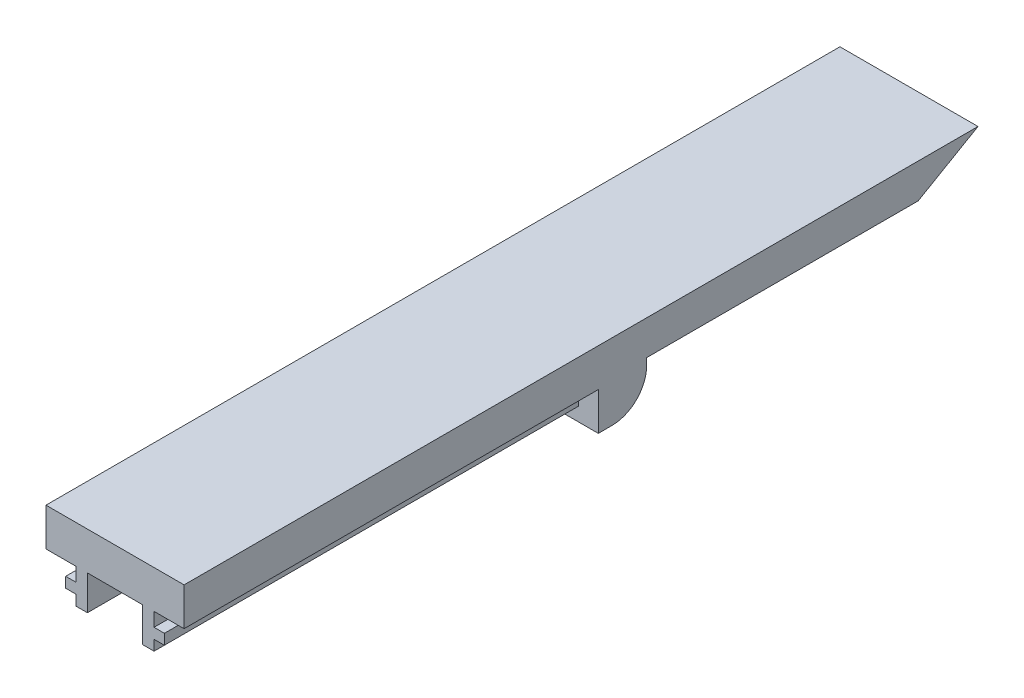
ISO-10303-21;
HEADER;
FILE_DESCRIPTION(('STEP AP214'),'2;1');
FILE_NAME('part.step','',(''),(''),'','','');
FILE_SCHEMA(('AUTOMOTIVE_DESIGN { 1 0 10303 214 1 1 1 1 }'));
ENDSEC;
DATA;
#1=APPLICATION_CONTEXT('core data for automotive mechanical design processes');
#2=APPLICATION_PROTOCOL_DEFINITION('international standard','automotive_design',2000,#1);
#3=PRODUCT_CONTEXT('',#1,'mechanical');
#4=PRODUCT('Part','Part','',(#3));
#5=PRODUCT_RELATED_PRODUCT_CATEGORY('part','',(#4));
#6=PRODUCT_DEFINITION_FORMATION('','',#4);
#7=PRODUCT_DEFINITION_CONTEXT('part definition',#1,'design');
#8=PRODUCT_DEFINITION('design','',#6,#7);
#9=PRODUCT_DEFINITION_SHAPE('','',#8);
#10=(LENGTH_UNIT() NAMED_UNIT(*) SI_UNIT(.MILLI.,.METRE.));
#11=(NAMED_UNIT(*) PLANE_ANGLE_UNIT() SI_UNIT($,.RADIAN.));
#12=(NAMED_UNIT(*) SI_UNIT($,.STERADIAN.) SOLID_ANGLE_UNIT());
#13=UNCERTAINTY_MEASURE_WITH_UNIT(LENGTH_MEASURE(1.E-05),#10,'distance_accuracy_value','');
#14=(GEOMETRIC_REPRESENTATION_CONTEXT(3) GLOBAL_UNCERTAINTY_ASSIGNED_CONTEXT((#13)) GLOBAL_UNIT_ASSIGNED_CONTEXT((#10,
#11,#12)) REPRESENTATION_CONTEXT('',''));
#15=CARTESIAN_POINT('',(0.,0.,0.));
#16=DIRECTION('',(0.,0.,1.));
#17=DIRECTION('',(1.,0.,0.));
#18=AXIS2_PLACEMENT_3D('',#15,#16,#17);
#19=CARTESIAN_POINT('',(0.,-39.8788629522422,-23.0240722604533));
#20=DIRECTION('',(0.,-0.866025403784438,-0.500000000000001));
#21=DIRECTION('',(0.,0.500000000000001,-0.866025403784438));
#22=AXIS2_PLACEMENT_3D('',#19,#20,#21);
#23=PLANE('',#22);
#24=DIRECTION('',(0.,0.500000000000001,-0.866025403784438));
#25=VECTOR('',#24,1.);
#26=CARTESIAN_POINT('',(-6.53631284916201,12.4734636871508,-113.700961894323));
#27=LINE('',#26,#25);
#28=CARTESIAN_POINT('',(-6.53631284916201,8.22346368715084,-106.339745962156));
#29=VERTEX_POINT('',#28);
#30=CARTESIAN_POINT('',(-6.53631284916201,13.2234636871508,-115.));
#31=VERTEX_POINT('',#30);
#32=EDGE_CURVE('E225',#29,#31,#27,.T.);
#33=ORIENTED_EDGE('',*,*,#32,.F.);
#34=DIRECTION('',(-1.,0.,0.));
#35=VECTOR('',#34,1.);
#36=CARTESIAN_POINT('',(0.,8.22346368715084,-106.339745962156));
#37=LINE('',#36,#35);
#38=CARTESIAN_POINT('',(-26.536312849162,8.22346368715083,-106.339745962156));
#39=VERTEX_POINT('',#38);
#40=EDGE_CURVE('E208',#29,#39,#37,.T.);
#41=ORIENTED_EDGE('',*,*,#40,.T.);
#42=DIRECTION('',(0.,-0.500000000000001,0.866025403784438));
#43=VECTOR('',#42,1.);
#44=CARTESIAN_POINT('',(-26.536312849162,12.4734636871508,-113.700961894323));
#45=LINE('',#44,#43);
#46=CARTESIAN_POINT('',(-26.536312849162,13.2234636871508,-115.));
#47=VERTEX_POINT('',#46);
#48=EDGE_CURVE('E229',#47,#39,#45,.T.);
#49=ORIENTED_EDGE('',*,*,#48,.F.);
#50=DIRECTION('',(-1.,0.,0.));
#51=VECTOR('',#50,1.);
#52=CARTESIAN_POINT('',(-6.53631284916201,13.2234636871508,-115.));
#53=LINE('',#52,#51);
#54=EDGE_CURVE('E241',#31,#47,#53,.T.);
#55=ORIENTED_EDGE('',*,*,#54,.F.);
#56=EDGE_LOOP('',(#33,#41,#49,#55));
#57=FACE_BOUND('',#56,.T.);
#58=ADVANCED_FACE('F37',(#57),#23,.T.);
#59=CARTESIAN_POINT('',(-26.536312849162,2.22346368715084,-115.));
#60=DIRECTION('',(0.,-1.,0.));
#61=DIRECTION('',(0.,0.,-1.));
#62=AXIS2_PLACEMENT_3D('',#59,#60,#61);
#63=PLANE('',#62);
#64=DIRECTION('',(0.,0.,1.));
#65=VECTOR('',#64,1.);
#66=CARTESIAN_POINT('',(-26.536312849162,2.22346368715084,-115.));
#67=LINE('',#66,#65);
#68=CARTESIAN_POINT('',(-26.536312849162,2.22346368715084,-62.));
#69=VERTEX_POINT('',#68);
#70=CARTESIAN_POINT('',(-26.536312849162,2.22346368715084,-60.));
#71=VERTEX_POINT('',#70);
#72=EDGE_CURVE('E396',#69,#71,#67,.T.);
#73=ORIENTED_EDGE('',*,*,#72,.F.);
#74=DIRECTION('',(-1.,0.,0.));
#75=VECTOR('',#74,1.);
#76=CARTESIAN_POINT('',(-6.53631284916201,2.22346368715084,-62.));
#77=LINE('',#76,#75);
#78=CARTESIAN_POINT('',(-6.53631284916201,2.22346368715084,-62.));
#79=VERTEX_POINT('',#78);
#80=EDGE_CURVE('E45',#69,#79,#77,.F.);
#81=ORIENTED_EDGE('',*,*,#80,.T.);
#82=DIRECTION('',(0.,0.,1.));
#83=VECTOR('',#82,1.);
#84=CARTESIAN_POINT('',(-6.53631284916201,2.22346368715084,-115.));
#85=LINE('',#84,#83);
#86=CARTESIAN_POINT('',(-6.53631284916201,2.22346368715084,-60.));
#87=VERTEX_POINT('',#86);
#88=EDGE_CURVE('E397',#79,#87,#85,.T.);
#89=ORIENTED_EDGE('',*,*,#88,.T.);
#90=DIRECTION('',(1.,0.,0.));
#91=VECTOR('',#90,1.);
#92=CARTESIAN_POINT('',(-26.536312849162,2.22346368715084,-60.));
#93=LINE('',#92,#91);
#94=EDGE_CURVE('E248',#71,#87,#93,.T.);
#95=ORIENTED_EDGE('',*,*,#94,.F.);
#96=EDGE_LOOP('',(#73,#81,#89,#95));
#97=FACE_BOUND('',#96,.T.);
#98=ADVANCED_FACE('F429',(#97),#63,.T.);
#99=CARTESIAN_POINT('',(-26.536312849162,10.2234636871508,-115.));
#100=DIRECTION('',(-1.,0.,0.));
#101=DIRECTION('',(0.,0.,1.));
#102=AXIS2_PLACEMENT_3D('',#99,#100,#101);
#103=PLANE('',#102);
#104=DIRECTION('',(0.,-1.,0.));
#105=VECTOR('',#104,1.);
#106=CARTESIAN_POINT('',(-26.536312849162,8.22346368715084,-67.));
#107=LINE('',#106,#105);
#108=CARTESIAN_POINT('',(-26.536312849162,8.22346368715084,-67.));
#109=VERTEX_POINT('',#108);
#110=CARTESIAN_POINT('',(-26.536312849162,7.22346368715084,-67.));
#111=VERTEX_POINT('',#110);
#112=EDGE_CURVE('E220',#109,#111,#107,.T.);
#113=ORIENTED_EDGE('',*,*,#112,.T.);
#114=CARTESIAN_POINT('',(-26.536312849162,7.22346368715084,-62.));
#115=DIRECTION('',(-1.,0.,0.));
#116=DIRECTION('',(0.,0.,1.));
#117=AXIS2_PLACEMENT_3D('',#114,#115,#116);
#118=CIRCLE('',#117,5.);
#119=EDGE_CURVE('E59',#111,#69,#118,.T.);
#120=ORIENTED_EDGE('',*,*,#119,.T.);
#121=ORIENTED_EDGE('',*,*,#72,.T.);
#122=DIRECTION('',(0.,-1.,0.));
#123=VECTOR('',#122,1.);
#124=CARTESIAN_POINT('',(-26.536312849162,7.72346368715084,-60.));
#125=LINE('',#124,#123);
#126=CARTESIAN_POINT('',(-26.536312849162,7.72346368715084,-60.));
#127=VERTEX_POINT('',#126);
#128=EDGE_CURVE('E245',#127,#71,#125,.T.);
#129=ORIENTED_EDGE('',*,*,#128,.F.);
#130=DIRECTION('',(0.,0.,1.));
#131=VECTOR('',#130,1.);
#132=CARTESIAN_POINT('',(-26.536312849162,7.72346368715084,-60.));
#133=LINE('',#132,#131);
#134=CARTESIAN_POINT('',(-26.536312849162,7.72346368715084,0.));
#135=VERTEX_POINT('',#134);
#136=EDGE_CURVE('E355',#127,#135,#133,.T.);
#137=ORIENTED_EDGE('',*,*,#136,.T.);
#138=DIRECTION('',(0.,-1.,0.));
#139=VECTOR('',#138,1.);
#140=CARTESIAN_POINT('',(-26.536312849162,10.2234636871508,0.));
#141=LINE('',#140,#139);
#142=CARTESIAN_POINT('',(-26.536312849162,13.2234636871508,0.));
#143=VERTEX_POINT('',#142);
#144=EDGE_CURVE('E358',#143,#135,#141,.T.);
#145=ORIENTED_EDGE('',*,*,#144,.F.);
#146=DIRECTION('',(0.,0.,1.));
#147=VECTOR('',#146,1.);
#148=CARTESIAN_POINT('',(-26.536312849162,13.2234636871508,-115.));
#149=LINE('',#148,#147);
#150=EDGE_CURVE('E232',#47,#143,#149,.T.);
#151=ORIENTED_EDGE('',*,*,#150,.F.);
#152=ORIENTED_EDGE('',*,*,#48,.T.);
#153=DIRECTION('',(0.,0.,-1.));
#154=VECTOR('',#153,1.);
#155=CARTESIAN_POINT('',(-26.536312849162,8.22346368715084,-67.));
#156=LINE('',#155,#154);
#157=EDGE_CURVE('E212',#109,#39,#156,.T.);
#158=ORIENTED_EDGE('',*,*,#157,.F.);
#159=EDGE_LOOP('',(#113,#120,#121,#129,#137,#145,#151,#152,#158));
#160=FACE_BOUND('',#159,.T.);
#161=ADVANCED_FACE('F404',(#160),#103,.T.);
#162=CARTESIAN_POINT('',(-6.53631284916201,10.2234636871508,-115.));
#163=DIRECTION('',(1.,0.,0.));
#164=DIRECTION('',(0.,1.,0.));
#165=AXIS2_PLACEMENT_3D('',#162,#163,#164);
#166=PLANE('',#165);
#167=ORIENTED_EDGE('',*,*,#88,.F.);
#168=CARTESIAN_POINT('',(-6.53631284916201,7.22346368715084,-62.));
#169=DIRECTION('',(1.,0.,0.));
#170=DIRECTION('',(0.,1.,0.));
#171=AXIS2_PLACEMENT_3D('',#168,#169,#170);
#172=CIRCLE('',#171,5.);
#173=CARTESIAN_POINT('',(-6.53631284916201,7.22346368715084,-67.));
#174=VERTEX_POINT('',#173);
#175=EDGE_CURVE('E11',#79,#174,#172,.T.);
#176=ORIENTED_EDGE('',*,*,#175,.T.);
#177=DIRECTION('',(0.,-1.,0.));
#178=VECTOR('',#177,1.);
#179=CARTESIAN_POINT('',(-6.53631284916201,8.22346368715084,-67.));
#180=LINE('',#179,#178);
#181=CARTESIAN_POINT('',(-6.53631284916201,8.22346368715084,-67.));
#182=VERTEX_POINT('',#181);
#183=EDGE_CURVE('E218',#182,#174,#180,.T.);
#184=ORIENTED_EDGE('',*,*,#183,.F.);
#185=DIRECTION('',(0.,0.,1.));
#186=VECTOR('',#185,1.);
#187=CARTESIAN_POINT('',(-6.53631284916201,8.22346368715084,-67.));
#188=LINE('',#187,#186);
#189=EDGE_CURVE('E202',#29,#182,#188,.T.);
#190=ORIENTED_EDGE('',*,*,#189,.F.);
#191=ORIENTED_EDGE('',*,*,#32,.T.);
#192=DIRECTION('',(0.,0.,-1.));
#193=VECTOR('',#192,1.);
#194=CARTESIAN_POINT('',(-6.53631284916201,13.2234636871508,0.));
#195=LINE('',#194,#193);
#196=CARTESIAN_POINT('',(-6.53631284916201,13.2234636871508,0.));
#197=VERTEX_POINT('',#196);
#198=EDGE_CURVE('E238',#197,#31,#195,.T.);
#199=ORIENTED_EDGE('',*,*,#198,.F.);
#200=DIRECTION('',(0.,1.,0.));
#201=VECTOR('',#200,1.);
#202=CARTESIAN_POINT('',(-6.53631284916201,10.2234636871508,0.));
#203=LINE('',#202,#201);
#204=CARTESIAN_POINT('',(-6.53631284916201,7.72346368715084,0.));
#205=VERTEX_POINT('',#204);
#206=EDGE_CURVE('E394',#205,#197,#203,.T.);
#207=ORIENTED_EDGE('',*,*,#206,.F.);
#208=DIRECTION('',(0.,0.,1.));
#209=VECTOR('',#208,1.);
#210=CARTESIAN_POINT('',(-6.53631284916202,7.72346368715084,-60.));
#211=LINE('',#210,#209);
#212=CARTESIAN_POINT('',(-6.53631284916202,7.72346368715084,-60.));
#213=VERTEX_POINT('',#212);
#214=EDGE_CURVE('E306',#213,#205,#211,.T.);
#215=ORIENTED_EDGE('',*,*,#214,.F.);
#216=DIRECTION('',(0.,1.,0.));
#217=VECTOR('',#216,1.);
#218=CARTESIAN_POINT('',(-6.53631284916202,7.72346368715084,-60.));
#219=LINE('',#218,#217);
#220=EDGE_CURVE('E252',#87,#213,#219,.T.);
#221=ORIENTED_EDGE('',*,*,#220,.F.);
#222=EDGE_LOOP('',(#167,#176,#184,#190,#191,#199,#207,#215,#221));
#223=FACE_BOUND('',#222,.T.);
#224=ADVANCED_FACE('F222',(#223),#166,.T.);
#225=CARTESIAN_POINT('',(0.,0.,0.));
#226=DIRECTION('',(0.,0.,1.));
#227=DIRECTION('',(1.,0.,0.));
#228=AXIS2_PLACEMENT_3D('',#225,#226,#227);
#229=PLANE('',#228);
#230=DIRECTION('',(-1.,0.,0.));
#231=VECTOR('',#230,1.);
#232=CARTESIAN_POINT('',(-26.536312849162,7.72346368715084,0.));
#233=LINE('',#232,#231);
#234=CARTESIAN_POINT('',(-22.186312849162,7.72346368715084,0.));
#235=VERTEX_POINT('',#234);
#236=EDGE_CURVE('E249',#235,#135,#233,.T.);
#237=ORIENTED_EDGE('',*,*,#236,.F.);
#238=DIRECTION('',(0.,1.,0.));
#239=VECTOR('',#238,1.);
#240=CARTESIAN_POINT('',(-22.186312849162,7.72346368715084,0.));
#241=LINE('',#240,#239);
#242=CARTESIAN_POINT('',(-22.186312849162,5.72346368715084,0.));
#243=VERTEX_POINT('',#242);
#244=EDGE_CURVE('E351',#243,#235,#241,.T.);
#245=ORIENTED_EDGE('',*,*,#244,.F.);
#246=DIRECTION('',(1.,0.,0.));
#247=VECTOR('',#246,1.);
#248=CARTESIAN_POINT('',(-22.186312849162,5.72346368715084,0.));
#249=LINE('',#248,#247);
#250=CARTESIAN_POINT('',(-23.686312849162,5.72346368715084,0.));
#251=VERTEX_POINT('',#250);
#252=EDGE_CURVE('E348',#251,#243,#249,.T.);
#253=ORIENTED_EDGE('',*,*,#252,.F.);
#254=DIRECTION('',(0.,1.,0.));
#255=VECTOR('',#254,1.);
#256=CARTESIAN_POINT('',(-23.686312849162,5.72346368715084,0.));
#257=LINE('',#256,#255);
#258=CARTESIAN_POINT('',(-23.686312849162,4.22346368715084,0.));
#259=VERTEX_POINT('',#258);
#260=EDGE_CURVE('E345',#259,#251,#257,.T.);
#261=ORIENTED_EDGE('',*,*,#260,.F.);
#262=DIRECTION('',(-1.,0.,0.));
#263=VECTOR('',#262,1.);
#264=CARTESIAN_POINT('',(-23.686312849162,4.22346368715084,0.));
#265=LINE('',#264,#263);
#266=CARTESIAN_POINT('',(-22.186312849162,4.22346368715084,0.));
#267=VERTEX_POINT('',#266);
#268=EDGE_CURVE('E342',#267,#259,#265,.T.);
#269=ORIENTED_EDGE('',*,*,#268,.F.);
#270=DIRECTION('',(0.,1.,0.));
#271=VECTOR('',#270,1.);
#272=CARTESIAN_POINT('',(-22.186312849162,4.22346368715084,0.));
#273=LINE('',#272,#271);
#274=CARTESIAN_POINT('',(-22.186312849162,2.72346368715084,0.));
#275=VERTEX_POINT('',#274);
#276=EDGE_CURVE('E339',#275,#267,#273,.T.);
#277=ORIENTED_EDGE('',*,*,#276,.F.);
#278=DIRECTION('',(-1.,0.,0.));
#279=VECTOR('',#278,1.);
#280=CARTESIAN_POINT('',(-22.186312849162,2.72346368715084,0.));
#281=LINE('',#280,#279);
#282=CARTESIAN_POINT('',(-20.536312849162,2.72346368715084,0.));
#283=VERTEX_POINT('',#282);
#284=EDGE_CURVE('E336',#283,#275,#281,.T.);
#285=ORIENTED_EDGE('',*,*,#284,.F.);
#286=DIRECTION('',(0.,-1.,0.));
#287=VECTOR('',#286,1.);
#288=CARTESIAN_POINT('',(-20.536312849162,2.72346368715084,0.));
#289=LINE('',#288,#287);
#290=CARTESIAN_POINT('',(-20.536312849162,7.72346368715084,0.));
#291=VERTEX_POINT('',#290);
#292=EDGE_CURVE('E333',#291,#283,#289,.T.);
#293=ORIENTED_EDGE('',*,*,#292,.F.);
#294=DIRECTION('',(-1.,0.,0.));
#295=VECTOR('',#294,1.);
#296=CARTESIAN_POINT('',(-20.536312849162,7.72346368715084,0.));
#297=LINE('',#296,#295);
#298=CARTESIAN_POINT('',(-12.536312849162,7.72346368715084,0.));
#299=VERTEX_POINT('',#298);
#300=EDGE_CURVE('E330',#299,#291,#297,.T.);
#301=ORIENTED_EDGE('',*,*,#300,.F.);
#302=DIRECTION('',(0.,1.,0.));
#303=VECTOR('',#302,1.);
#304=CARTESIAN_POINT('',(-12.536312849162,2.72346368715084,0.));
#305=LINE('',#304,#303);
#306=CARTESIAN_POINT('',(-12.536312849162,2.72346368715084,0.));
#307=VERTEX_POINT('',#306);
#308=EDGE_CURVE('E327',#307,#299,#305,.T.);
#309=ORIENTED_EDGE('',*,*,#308,.F.);
#310=DIRECTION('',(-1.,0.,0.));
#311=VECTOR('',#310,1.);
#312=CARTESIAN_POINT('',(-10.886312849162,2.72346368715084,0.));
#313=LINE('',#312,#311);
#314=CARTESIAN_POINT('',(-10.886312849162,2.72346368715084,0.));
#315=VERTEX_POINT('',#314);
#316=EDGE_CURVE('E324',#315,#307,#313,.T.);
#317=ORIENTED_EDGE('',*,*,#316,.F.);
#318=DIRECTION('',(0.,-1.,0.));
#319=VECTOR('',#318,1.);
#320=CARTESIAN_POINT('',(-10.886312849162,4.22346368715084,0.));
#321=LINE('',#320,#319);
#322=CARTESIAN_POINT('',(-10.886312849162,4.22346368715084,0.));
#323=VERTEX_POINT('',#322);
#324=EDGE_CURVE('E321',#323,#315,#321,.T.);
#325=ORIENTED_EDGE('',*,*,#324,.F.);
#326=DIRECTION('',(-1.,0.,0.));
#327=VECTOR('',#326,1.);
#328=CARTESIAN_POINT('',(-9.38631284916202,4.22346368715084,0.));
#329=LINE('',#328,#327);
#330=CARTESIAN_POINT('',(-9.38631284916202,4.22346368715084,0.));
#331=VERTEX_POINT('',#330);
#332=EDGE_CURVE('E318',#331,#323,#329,.T.);
#333=ORIENTED_EDGE('',*,*,#332,.F.);
#334=DIRECTION('',(0.,-1.,0.));
#335=VECTOR('',#334,1.);
#336=CARTESIAN_POINT('',(-9.38631284916202,5.72346368715084,0.));
#337=LINE('',#336,#335);
#338=CARTESIAN_POINT('',(-9.38631284916202,5.72346368715084,0.));
#339=VERTEX_POINT('',#338);
#340=EDGE_CURVE('E315',#339,#331,#337,.T.);
#341=ORIENTED_EDGE('',*,*,#340,.F.);
#342=DIRECTION('',(1.,0.,0.));
#343=VECTOR('',#342,1.);
#344=CARTESIAN_POINT('',(-10.886312849162,5.72346368715084,0.));
#345=LINE('',#344,#343);
#346=CARTESIAN_POINT('',(-10.886312849162,5.72346368715084,0.));
#347=VERTEX_POINT('',#346);
#348=EDGE_CURVE('E312',#347,#339,#345,.T.);
#349=ORIENTED_EDGE('',*,*,#348,.F.);
#350=DIRECTION('',(0.,-1.,0.));
#351=VECTOR('',#350,1.);
#352=CARTESIAN_POINT('',(-10.886312849162,7.72346368715084,0.));
#353=LINE('',#352,#351);
#354=CARTESIAN_POINT('',(-10.886312849162,7.72346368715084,0.));
#355=VERTEX_POINT('',#354);
#356=EDGE_CURVE('E309',#355,#347,#353,.T.);
#357=ORIENTED_EDGE('',*,*,#356,.F.);
#358=DIRECTION('',(-1.,0.,0.));
#359=VECTOR('',#358,1.);
#360=CARTESIAN_POINT('',(-6.53631284916202,7.72346368715084,0.));
#361=LINE('',#360,#359);
#362=EDGE_CURVE('E244',#205,#355,#361,.T.);
#363=ORIENTED_EDGE('',*,*,#362,.F.);
#364=ORIENTED_EDGE('',*,*,#206,.T.);
#365=DIRECTION('',(1.,0.,0.));
#366=VECTOR('',#365,1.);
#367=CARTESIAN_POINT('',(-26.536312849162,13.2234636871508,0.));
#368=LINE('',#367,#366);
#369=EDGE_CURVE('E235',#143,#197,#368,.T.);
#370=ORIENTED_EDGE('',*,*,#369,.F.);
#371=ORIENTED_EDGE('',*,*,#144,.T.);
#372=EDGE_LOOP('',(#237,#245,#253,#261,#269,#277,#285,#293,#301,#309,#317,#325,#333,#341,#349,
#357,#363,#364,#370,#371));
#373=FACE_BOUND('',#372,.T.);
#374=ADVANCED_FACE('F417',(#373),#229,.T.);
#375=CARTESIAN_POINT('',(-26.536312849162,7.72346368715084,-60.));
#376=DIRECTION('',(0.,1.,0.));
#377=DIRECTION('',(0.,0.,1.));
#378=AXIS2_PLACEMENT_3D('',#375,#376,#377);
#379=PLANE('',#378);
#380=ORIENTED_EDGE('',*,*,#236,.T.);
#381=ORIENTED_EDGE('',*,*,#136,.F.);
#382=DIRECTION('',(-1.,0.,0.));
#383=VECTOR('',#382,1.);
#384=CARTESIAN_POINT('',(-26.536312849162,7.72346368715084,-60.));
#385=LINE('',#384,#383);
#386=CARTESIAN_POINT('',(-22.186312849162,7.72346368715084,-60.));
#387=VERTEX_POINT('',#386);
#388=EDGE_CURVE('E303',#387,#127,#385,.T.);
#389=ORIENTED_EDGE('',*,*,#388,.F.);
#390=DIRECTION('',(0.,0.,1.));
#391=VECTOR('',#390,1.);
#392=CARTESIAN_POINT('',(-22.186312849162,7.72346368715084,-60.));
#393=LINE('',#392,#391);
#394=EDGE_CURVE('E359',#387,#235,#393,.T.);
#395=ORIENTED_EDGE('',*,*,#394,.T.);
#396=EDGE_LOOP('',(#380,#381,#389,#395));
#397=FACE_BOUND('',#396,.T.);
#398=ADVANCED_FACE('F447',(#397),#379,.F.);
#399=CARTESIAN_POINT('',(-22.186312849162,7.72346368715084,-60.));
#400=DIRECTION('',(1.,0.,0.));
#401=DIRECTION('',(0.,1.,0.));
#402=AXIS2_PLACEMENT_3D('',#399,#400,#401);
#403=PLANE('',#402);
#404=ORIENTED_EDGE('',*,*,#244,.T.);
#405=ORIENTED_EDGE('',*,*,#394,.F.);
#406=DIRECTION('',(0.,1.,0.));
#407=VECTOR('',#406,1.);
#408=CARTESIAN_POINT('',(-22.186312849162,7.72346368715084,-60.));
#409=LINE('',#408,#407);
#410=CARTESIAN_POINT('',(-22.186312849162,5.72346368715084,-60.));
#411=VERTEX_POINT('',#410);
#412=EDGE_CURVE('E300',#411,#387,#409,.T.);
#413=ORIENTED_EDGE('',*,*,#412,.F.);
#414=DIRECTION('',(0.,0.,1.));
#415=VECTOR('',#414,1.);
#416=CARTESIAN_POINT('',(-22.186312849162,5.72346368715084,-60.));
#417=LINE('',#416,#415);
#418=EDGE_CURVE('E361',#411,#243,#417,.T.);
#419=ORIENTED_EDGE('',*,*,#418,.T.);
#420=EDGE_LOOP('',(#404,#405,#413,#419));
#421=FACE_BOUND('',#420,.T.);
#422=ADVANCED_FACE('F450',(#421),#403,.F.);
#423=CARTESIAN_POINT('',(-22.186312849162,5.72346368715084,-60.));
#424=DIRECTION('',(0.,-1.,0.));
#425=DIRECTION('',(0.,0.,-1.));
#426=AXIS2_PLACEMENT_3D('',#423,#424,#425);
#427=PLANE('',#426);
#428=ORIENTED_EDGE('',*,*,#252,.T.);
#429=ORIENTED_EDGE('',*,*,#418,.F.);
#430=DIRECTION('',(1.,0.,0.));
#431=VECTOR('',#430,1.);
#432=CARTESIAN_POINT('',(-22.186312849162,5.72346368715084,-60.));
#433=LINE('',#432,#431);
#434=CARTESIAN_POINT('',(-23.686312849162,5.72346368715084,-60.));
#435=VERTEX_POINT('',#434);
#436=EDGE_CURVE('E297',#435,#411,#433,.T.);
#437=ORIENTED_EDGE('',*,*,#436,.F.);
#438=DIRECTION('',(0.,0.,1.));
#439=VECTOR('',#438,1.);
#440=CARTESIAN_POINT('',(-23.686312849162,5.72346368715084,-60.));
#441=LINE('',#440,#439);
#442=EDGE_CURVE('E363',#435,#251,#441,.T.);
#443=ORIENTED_EDGE('',*,*,#442,.T.);
#444=EDGE_LOOP('',(#428,#429,#437,#443));
#445=FACE_BOUND('',#444,.T.);
#446=ADVANCED_FACE('F454',(#445),#427,.F.);
#447=CARTESIAN_POINT('',(-23.686312849162,5.72346368715084,-60.));
#448=DIRECTION('',(1.,0.,0.));
#449=DIRECTION('',(0.,0.,-1.));
#450=AXIS2_PLACEMENT_3D('',#447,#448,#449);
#451=PLANE('',#450);
#452=ORIENTED_EDGE('',*,*,#260,.T.);
#453=ORIENTED_EDGE('',*,*,#442,.F.);
#454=DIRECTION('',(0.,1.,0.));
#455=VECTOR('',#454,1.);
#456=CARTESIAN_POINT('',(-23.686312849162,5.72346368715084,-60.));
#457=LINE('',#456,#455);
#458=CARTESIAN_POINT('',(-23.686312849162,4.22346368715084,-60.));
#459=VERTEX_POINT('',#458);
#460=EDGE_CURVE('E294',#459,#435,#457,.T.);
#461=ORIENTED_EDGE('',*,*,#460,.F.);
#462=DIRECTION('',(0.,0.,1.));
#463=VECTOR('',#462,1.);
#464=CARTESIAN_POINT('',(-23.686312849162,4.22346368715084,-60.));
#465=LINE('',#464,#463);
#466=EDGE_CURVE('E365',#459,#259,#465,.T.);
#467=ORIENTED_EDGE('',*,*,#466,.T.);
#468=EDGE_LOOP('',(#452,#453,#461,#467));
#469=FACE_BOUND('',#468,.T.);
#470=ADVANCED_FACE('F458',(#469),#451,.F.);
#471=CARTESIAN_POINT('',(-23.686312849162,4.22346368715084,-60.));
#472=DIRECTION('',(0.,1.,0.));
#473=DIRECTION('',(0.,0.,1.));
#474=AXIS2_PLACEMENT_3D('',#471,#472,#473);
#475=PLANE('',#474);
#476=ORIENTED_EDGE('',*,*,#268,.T.);
#477=ORIENTED_EDGE('',*,*,#466,.F.);
#478=DIRECTION('',(-1.,0.,0.));
#479=VECTOR('',#478,1.);
#480=CARTESIAN_POINT('',(-23.686312849162,4.22346368715084,-60.));
#481=LINE('',#480,#479);
#482=CARTESIAN_POINT('',(-22.186312849162,4.22346368715084,-60.));
#483=VERTEX_POINT('',#482);
#484=EDGE_CURVE('E291',#483,#459,#481,.T.);
#485=ORIENTED_EDGE('',*,*,#484,.F.);
#486=DIRECTION('',(0.,0.,1.));
#487=VECTOR('',#486,1.);
#488=CARTESIAN_POINT('',(-22.186312849162,4.22346368715084,-60.));
#489=LINE('',#488,#487);
#490=EDGE_CURVE('E367',#483,#267,#489,.T.);
#491=ORIENTED_EDGE('',*,*,#490,.T.);
#492=EDGE_LOOP('',(#476,#477,#485,#491));
#493=FACE_BOUND('',#492,.T.);
#494=ADVANCED_FACE('F462',(#493),#475,.F.);
#495=CARTESIAN_POINT('',(-22.186312849162,4.22346368715084,-60.));
#496=DIRECTION('',(1.,0.,0.));
#497=DIRECTION('',(0.,0.,-1.));
#498=AXIS2_PLACEMENT_3D('',#495,#496,#497);
#499=PLANE('',#498);
#500=ORIENTED_EDGE('',*,*,#276,.T.);
#501=ORIENTED_EDGE('',*,*,#490,.F.);
#502=DIRECTION('',(0.,1.,0.));
#503=VECTOR('',#502,1.);
#504=CARTESIAN_POINT('',(-22.186312849162,4.22346368715084,-60.));
#505=LINE('',#504,#503);
#506=CARTESIAN_POINT('',(-22.186312849162,2.72346368715084,-60.));
#507=VERTEX_POINT('',#506);
#508=EDGE_CURVE('E288',#507,#483,#505,.T.);
#509=ORIENTED_EDGE('',*,*,#508,.F.);
#510=DIRECTION('',(0.,0.,1.));
#511=VECTOR('',#510,1.);
#512=CARTESIAN_POINT('',(-22.186312849162,2.72346368715084,-60.));
#513=LINE('',#512,#511);
#514=EDGE_CURVE('E369',#507,#275,#513,.T.);
#515=ORIENTED_EDGE('',*,*,#514,.T.);
#516=EDGE_LOOP('',(#500,#501,#509,#515));
#517=FACE_BOUND('',#516,.T.);
#518=ADVANCED_FACE('F466',(#517),#499,.F.);
#519=CARTESIAN_POINT('',(-22.186312849162,2.72346368715084,-60.));
#520=DIRECTION('',(0.,1.,0.));
#521=DIRECTION('',(0.,0.,1.));
#522=AXIS2_PLACEMENT_3D('',#519,#520,#521);
#523=PLANE('',#522);
#524=ORIENTED_EDGE('',*,*,#284,.T.);
#525=ORIENTED_EDGE('',*,*,#514,.F.);
#526=DIRECTION('',(-1.,0.,0.));
#527=VECTOR('',#526,1.);
#528=CARTESIAN_POINT('',(-22.186312849162,2.72346368715084,-60.));
#529=LINE('',#528,#527);
#530=CARTESIAN_POINT('',(-20.536312849162,2.72346368715084,-60.));
#531=VERTEX_POINT('',#530);
#532=EDGE_CURVE('E285',#531,#507,#529,.T.);
#533=ORIENTED_EDGE('',*,*,#532,.F.);
#534=DIRECTION('',(0.,0.,1.));
#535=VECTOR('',#534,1.);
#536=CARTESIAN_POINT('',(-20.536312849162,2.72346368715084,-60.));
#537=LINE('',#536,#535);
#538=EDGE_CURVE('E371',#531,#283,#537,.T.);
#539=ORIENTED_EDGE('',*,*,#538,.T.);
#540=EDGE_LOOP('',(#524,#525,#533,#539));
#541=FACE_BOUND('',#540,.T.);
#542=ADVANCED_FACE('F470',(#541),#523,.F.);
#543=CARTESIAN_POINT('',(-20.536312849162,2.72346368715084,-60.));
#544=DIRECTION('',(-1.,0.,0.));
#545=DIRECTION('',(0.,0.,1.));
#546=AXIS2_PLACEMENT_3D('',#543,#544,#545);
#547=PLANE('',#546);
#548=ORIENTED_EDGE('',*,*,#292,.T.);
#549=ORIENTED_EDGE('',*,*,#538,.F.);
#550=DIRECTION('',(0.,-1.,0.));
#551=VECTOR('',#550,1.);
#552=CARTESIAN_POINT('',(-20.536312849162,2.72346368715084,-60.));
#553=LINE('',#552,#551);
#554=CARTESIAN_POINT('',(-20.536312849162,7.72346368715084,-60.));
#555=VERTEX_POINT('',#554);
#556=EDGE_CURVE('E282',#555,#531,#553,.T.);
#557=ORIENTED_EDGE('',*,*,#556,.F.);
#558=DIRECTION('',(0.,0.,1.));
#559=VECTOR('',#558,1.);
#560=CARTESIAN_POINT('',(-20.536312849162,7.72346368715084,-60.));
#561=LINE('',#560,#559);
#562=EDGE_CURVE('E373',#555,#291,#561,.T.);
#563=ORIENTED_EDGE('',*,*,#562,.T.);
#564=EDGE_LOOP('',(#548,#549,#557,#563));
#565=FACE_BOUND('',#564,.T.);
#566=ADVANCED_FACE('F474',(#565),#547,.F.);
#567=CARTESIAN_POINT('',(-20.536312849162,7.72346368715084,-60.));
#568=DIRECTION('',(0.,1.,0.));
#569=DIRECTION('',(0.,0.,1.));
#570=AXIS2_PLACEMENT_3D('',#567,#568,#569);
#571=PLANE('',#570);
#572=ORIENTED_EDGE('',*,*,#300,.T.);
#573=ORIENTED_EDGE('',*,*,#562,.F.);
#574=DIRECTION('',(-1.,0.,0.));
#575=VECTOR('',#574,1.);
#576=CARTESIAN_POINT('',(-20.536312849162,7.72346368715084,-60.));
#577=LINE('',#576,#575);
#578=CARTESIAN_POINT('',(-12.536312849162,7.72346368715084,-60.));
#579=VERTEX_POINT('',#578);
#580=EDGE_CURVE('E279',#579,#555,#577,.T.);
#581=ORIENTED_EDGE('',*,*,#580,.F.);
#582=DIRECTION('',(0.,0.,1.));
#583=VECTOR('',#582,1.);
#584=CARTESIAN_POINT('',(-12.536312849162,7.72346368715084,-60.));
#585=LINE('',#584,#583);
#586=EDGE_CURVE('E375',#579,#299,#585,.T.);
#587=ORIENTED_EDGE('',*,*,#586,.T.);
#588=EDGE_LOOP('',(#572,#573,#581,#587));
#589=FACE_BOUND('',#588,.T.);
#590=ADVANCED_FACE('F478',(#589),#571,.F.);
#591=CARTESIAN_POINT('',(-12.536312849162,2.72346368715084,-60.));
#592=DIRECTION('',(1.,0.,0.));
#593=DIRECTION('',(0.,0.,-1.));
#594=AXIS2_PLACEMENT_3D('',#591,#592,#593);
#595=PLANE('',#594);
#596=ORIENTED_EDGE('',*,*,#308,.T.);
#597=ORIENTED_EDGE('',*,*,#586,.F.);
#598=DIRECTION('',(0.,1.,0.));
#599=VECTOR('',#598,1.);
#600=CARTESIAN_POINT('',(-12.536312849162,2.72346368715084,-60.));
#601=LINE('',#600,#599);
#602=CARTESIAN_POINT('',(-12.536312849162,2.72346368715084,-60.));
#603=VERTEX_POINT('',#602);
#604=EDGE_CURVE('E276',#603,#579,#601,.T.);
#605=ORIENTED_EDGE('',*,*,#604,.F.);
#606=DIRECTION('',(0.,0.,1.));
#607=VECTOR('',#606,1.);
#608=CARTESIAN_POINT('',(-12.536312849162,2.72346368715084,-60.));
#609=LINE('',#608,#607);
#610=EDGE_CURVE('E377',#603,#307,#609,.T.);
#611=ORIENTED_EDGE('',*,*,#610,.T.);
#612=EDGE_LOOP('',(#596,#597,#605,#611));
#613=FACE_BOUND('',#612,.T.);
#614=ADVANCED_FACE('F482',(#613),#595,.F.);
#615=CARTESIAN_POINT('',(-10.886312849162,2.72346368715084,-60.));
#616=DIRECTION('',(0.,1.,0.));
#617=DIRECTION('',(0.,0.,1.));
#618=AXIS2_PLACEMENT_3D('',#615,#616,#617);
#619=PLANE('',#618);
#620=ORIENTED_EDGE('',*,*,#316,.T.);
#621=ORIENTED_EDGE('',*,*,#610,.F.);
#622=DIRECTION('',(-1.,0.,0.));
#623=VECTOR('',#622,1.);
#624=CARTESIAN_POINT('',(-10.886312849162,2.72346368715084,-60.));
#625=LINE('',#624,#623);
#626=CARTESIAN_POINT('',(-10.886312849162,2.72346368715084,-60.));
#627=VERTEX_POINT('',#626);
#628=EDGE_CURVE('E273',#627,#603,#625,.T.);
#629=ORIENTED_EDGE('',*,*,#628,.F.);
#630=DIRECTION('',(0.,0.,1.));
#631=VECTOR('',#630,1.);
#632=CARTESIAN_POINT('',(-10.886312849162,2.72346368715084,-60.));
#633=LINE('',#632,#631);
#634=EDGE_CURVE('E379',#627,#315,#633,.T.);
#635=ORIENTED_EDGE('',*,*,#634,.T.);
#636=EDGE_LOOP('',(#620,#621,#629,#635));
#637=FACE_BOUND('',#636,.T.);
#638=ADVANCED_FACE('F486',(#637),#619,.F.);
#639=CARTESIAN_POINT('',(-10.886312849162,4.22346368715084,-60.));
#640=DIRECTION('',(-1.,0.,0.));
#641=DIRECTION('',(0.,0.,1.));
#642=AXIS2_PLACEMENT_3D('',#639,#640,#641);
#643=PLANE('',#642);
#644=ORIENTED_EDGE('',*,*,#324,.T.);
#645=ORIENTED_EDGE('',*,*,#634,.F.);
#646=DIRECTION('',(0.,-1.,0.));
#647=VECTOR('',#646,1.);
#648=CARTESIAN_POINT('',(-10.886312849162,4.22346368715084,-60.));
#649=LINE('',#648,#647);
#650=CARTESIAN_POINT('',(-10.886312849162,4.22346368715084,-60.));
#651=VERTEX_POINT('',#650);
#652=EDGE_CURVE('E270',#651,#627,#649,.T.);
#653=ORIENTED_EDGE('',*,*,#652,.F.);
#654=DIRECTION('',(0.,0.,1.));
#655=VECTOR('',#654,1.);
#656=CARTESIAN_POINT('',(-10.886312849162,4.22346368715084,-60.));
#657=LINE('',#656,#655);
#658=EDGE_CURVE('E381',#651,#323,#657,.T.);
#659=ORIENTED_EDGE('',*,*,#658,.T.);
#660=EDGE_LOOP('',(#644,#645,#653,#659));
#661=FACE_BOUND('',#660,.T.);
#662=ADVANCED_FACE('F490',(#661),#643,.F.);
#663=CARTESIAN_POINT('',(-9.38631284916202,4.22346368715084,-60.));
#664=DIRECTION('',(0.,1.,0.));
#665=DIRECTION('',(0.,0.,1.));
#666=AXIS2_PLACEMENT_3D('',#663,#664,#665);
#667=PLANE('',#666);
#668=ORIENTED_EDGE('',*,*,#332,.T.);
#669=ORIENTED_EDGE('',*,*,#658,.F.);
#670=DIRECTION('',(-1.,0.,0.));
#671=VECTOR('',#670,1.);
#672=CARTESIAN_POINT('',(-9.38631284916202,4.22346368715084,-60.));
#673=LINE('',#672,#671);
#674=CARTESIAN_POINT('',(-9.38631284916202,4.22346368715084,-60.));
#675=VERTEX_POINT('',#674);
#676=EDGE_CURVE('E267',#675,#651,#673,.T.);
#677=ORIENTED_EDGE('',*,*,#676,.F.);
#678=DIRECTION('',(0.,0.,1.));
#679=VECTOR('',#678,1.);
#680=CARTESIAN_POINT('',(-9.38631284916202,4.22346368715084,-60.));
#681=LINE('',#680,#679);
#682=EDGE_CURVE('E383',#675,#331,#681,.T.);
#683=ORIENTED_EDGE('',*,*,#682,.T.);
#684=EDGE_LOOP('',(#668,#669,#677,#683));
#685=FACE_BOUND('',#684,.T.);
#686=ADVANCED_FACE('F494',(#685),#667,.F.);
#687=CARTESIAN_POINT('',(-9.38631284916202,5.72346368715084,-60.));
#688=DIRECTION('',(-1.,0.,0.));
#689=DIRECTION('',(0.,0.,1.));
#690=AXIS2_PLACEMENT_3D('',#687,#688,#689);
#691=PLANE('',#690);
#692=ORIENTED_EDGE('',*,*,#340,.T.);
#693=ORIENTED_EDGE('',*,*,#682,.F.);
#694=DIRECTION('',(0.,-1.,0.));
#695=VECTOR('',#694,1.);
#696=CARTESIAN_POINT('',(-9.38631284916202,5.72346368715084,-60.));
#697=LINE('',#696,#695);
#698=CARTESIAN_POINT('',(-9.38631284916202,5.72346368715084,-60.));
#699=VERTEX_POINT('',#698);
#700=EDGE_CURVE('E264',#699,#675,#697,.T.);
#701=ORIENTED_EDGE('',*,*,#700,.F.);
#702=DIRECTION('',(0.,0.,1.));
#703=VECTOR('',#702,1.);
#704=CARTESIAN_POINT('',(-9.38631284916202,5.72346368715084,-60.));
#705=LINE('',#704,#703);
#706=EDGE_CURVE('E385',#699,#339,#705,.T.);
#707=ORIENTED_EDGE('',*,*,#706,.T.);
#708=EDGE_LOOP('',(#692,#693,#701,#707));
#709=FACE_BOUND('',#708,.T.);
#710=ADVANCED_FACE('F498',(#709),#691,.F.);
#711=CARTESIAN_POINT('',(-10.886312849162,5.72346368715084,-60.));
#712=DIRECTION('',(0.,-1.,0.));
#713=DIRECTION('',(0.,0.,-1.));
#714=AXIS2_PLACEMENT_3D('',#711,#712,#713);
#715=PLANE('',#714);
#716=ORIENTED_EDGE('',*,*,#348,.T.);
#717=ORIENTED_EDGE('',*,*,#706,.F.);
#718=DIRECTION('',(1.,0.,0.));
#719=VECTOR('',#718,1.);
#720=CARTESIAN_POINT('',(-10.886312849162,5.72346368715084,-60.));
#721=LINE('',#720,#719);
#722=CARTESIAN_POINT('',(-10.886312849162,5.72346368715084,-60.));
#723=VERTEX_POINT('',#722);
#724=EDGE_CURVE('E261',#723,#699,#721,.T.);
#725=ORIENTED_EDGE('',*,*,#724,.F.);
#726=DIRECTION('',(0.,0.,1.));
#727=VECTOR('',#726,1.);
#728=CARTESIAN_POINT('',(-10.886312849162,5.72346368715084,-60.));
#729=LINE('',#728,#727);
#730=EDGE_CURVE('E387',#723,#347,#729,.T.);
#731=ORIENTED_EDGE('',*,*,#730,.T.);
#732=EDGE_LOOP('',(#716,#717,#725,#731));
#733=FACE_BOUND('',#732,.T.);
#734=ADVANCED_FACE('F502',(#733),#715,.F.);
#735=CARTESIAN_POINT('',(-10.886312849162,7.72346368715084,-60.));
#736=DIRECTION('',(-1.,0.,0.));
#737=DIRECTION('',(0.,-1.,0.));
#738=AXIS2_PLACEMENT_3D('',#735,#736,#737);
#739=PLANE('',#738);
#740=ORIENTED_EDGE('',*,*,#356,.T.);
#741=ORIENTED_EDGE('',*,*,#730,.F.);
#742=DIRECTION('',(0.,-1.,0.));
#743=VECTOR('',#742,1.);
#744=CARTESIAN_POINT('',(-10.886312849162,7.72346368715084,-60.));
#745=LINE('',#744,#743);
#746=CARTESIAN_POINT('',(-10.886312849162,7.72346368715084,-60.));
#747=VERTEX_POINT('',#746);
#748=EDGE_CURVE('E258',#747,#723,#745,.T.);
#749=ORIENTED_EDGE('',*,*,#748,.F.);
#750=DIRECTION('',(0.,0.,1.));
#751=VECTOR('',#750,1.);
#752=CARTESIAN_POINT('',(-10.886312849162,7.72346368715084,-60.));
#753=LINE('',#752,#751);
#754=EDGE_CURVE('E389',#747,#355,#753,.T.);
#755=ORIENTED_EDGE('',*,*,#754,.T.);
#756=EDGE_LOOP('',(#740,#741,#749,#755));
#757=FACE_BOUND('',#756,.T.);
#758=ADVANCED_FACE('F506',(#757),#739,.F.);
#759=CARTESIAN_POINT('',(-6.53631284916202,7.72346368715084,-60.));
#760=DIRECTION('',(0.,1.,0.));
#761=DIRECTION('',(0.,0.,1.));
#762=AXIS2_PLACEMENT_3D('',#759,#760,#761);
#763=PLANE('',#762);
#764=ORIENTED_EDGE('',*,*,#362,.T.);
#765=ORIENTED_EDGE('',*,*,#754,.F.);
#766=DIRECTION('',(-1.,0.,0.));
#767=VECTOR('',#766,1.);
#768=CARTESIAN_POINT('',(-6.53631284916202,7.72346368715084,-60.));
#769=LINE('',#768,#767);
#770=EDGE_CURVE('E255',#213,#747,#769,.T.);
#771=ORIENTED_EDGE('',*,*,#770,.F.);
#772=ORIENTED_EDGE('',*,*,#214,.T.);
#773=EDGE_LOOP('',(#764,#765,#771,#772));
#774=FACE_BOUND('',#773,.T.);
#775=ADVANCED_FACE('F422',(#774),#763,.F.);
#776=CARTESIAN_POINT('',(0.,0.,-60.));
#777=DIRECTION('',(0.,0.,1.));
#778=DIRECTION('',(1.,0.,0.));
#779=AXIS2_PLACEMENT_3D('',#776,#777,#778);
#780=PLANE('',#779);
#781=ORIENTED_EDGE('',*,*,#128,.T.);
#782=ORIENTED_EDGE('',*,*,#94,.T.);
#783=ORIENTED_EDGE('',*,*,#220,.T.);
#784=ORIENTED_EDGE('',*,*,#770,.T.);
#785=ORIENTED_EDGE('',*,*,#748,.T.);
#786=ORIENTED_EDGE('',*,*,#724,.T.);
#787=ORIENTED_EDGE('',*,*,#700,.T.);
#788=ORIENTED_EDGE('',*,*,#676,.T.);
#789=ORIENTED_EDGE('',*,*,#652,.T.);
#790=ORIENTED_EDGE('',*,*,#628,.T.);
#791=ORIENTED_EDGE('',*,*,#604,.T.);
#792=ORIENTED_EDGE('',*,*,#580,.T.);
#793=ORIENTED_EDGE('',*,*,#556,.T.);
#794=ORIENTED_EDGE('',*,*,#532,.T.);
#795=ORIENTED_EDGE('',*,*,#508,.T.);
#796=ORIENTED_EDGE('',*,*,#484,.T.);
#797=ORIENTED_EDGE('',*,*,#460,.T.);
#798=ORIENTED_EDGE('',*,*,#436,.T.);
#799=ORIENTED_EDGE('',*,*,#412,.T.);
#800=ORIENTED_EDGE('',*,*,#388,.T.);
#801=EDGE_LOOP('',(#781,#782,#783,#784,#785,#786,#787,#788,#789,#790,#791,#792,#793,#794,#795,
#796,#797,#798,#799,#800));
#802=FACE_BOUND('',#801,.T.);
#803=ADVANCED_FACE('F426',(#802),#780,.T.);
#804=CARTESIAN_POINT('',(0.,13.2234636871508,0.));
#805=DIRECTION('',(0.,1.,0.));
#806=DIRECTION('',(0.,0.,1.));
#807=AXIS2_PLACEMENT_3D('',#804,#805,#806);
#808=PLANE('',#807);
#809=ORIENTED_EDGE('',*,*,#150,.T.);
#810=ORIENTED_EDGE('',*,*,#369,.T.);
#811=ORIENTED_EDGE('',*,*,#198,.T.);
#812=ORIENTED_EDGE('',*,*,#54,.T.);
#813=EDGE_LOOP('',(#809,#810,#811,#812));
#814=FACE_BOUND('',#813,.T.);
#815=ADVANCED_FACE('F413',(#814),#808,.T.);
#816=CARTESIAN_POINT('',(-26.536312849162,8.22346368715084,-67.));
#817=DIRECTION('',(0.,0.,1.));
#818=DIRECTION('',(1.,0.,0.));
#819=AXIS2_PLACEMENT_3D('',#816,#817,#818);
#820=PLANE('',#819);
#821=ORIENTED_EDGE('',*,*,#183,.T.);
#822=DIRECTION('',(-1.,0.,0.));
#823=VECTOR('',#822,1.);
#824=CARTESIAN_POINT('',(-26.536312849162,7.22346368715084,-67.));
#825=LINE('',#824,#823);
#826=EDGE_CURVE('E401',#174,#111,#825,.T.);
#827=ORIENTED_EDGE('',*,*,#826,.T.);
#828=ORIENTED_EDGE('',*,*,#112,.F.);
#829=DIRECTION('',(-1.,0.,0.));
#830=VECTOR('',#829,1.);
#831=CARTESIAN_POINT('',(-26.536312849162,8.22346368715084,-67.));
#832=LINE('',#831,#830);
#833=EDGE_CURVE('E205',#182,#109,#832,.T.);
#834=ORIENTED_EDGE('',*,*,#833,.F.);
#835=EDGE_LOOP('',(#821,#827,#828,#834));
#836=FACE_BOUND('',#835,.T.);
#837=ADVANCED_FACE('F216',(#836),#820,.F.);
#838=CARTESIAN_POINT('',(0.,8.22346368715084,0.));
#839=DIRECTION('',(0.,-1.,0.));
#840=DIRECTION('',(0.,0.,-1.));
#841=AXIS2_PLACEMENT_3D('',#838,#839,#840);
#842=PLANE('',#841);
#843=ORIENTED_EDGE('',*,*,#189,.T.);
#844=ORIENTED_EDGE('',*,*,#833,.T.);
#845=ORIENTED_EDGE('',*,*,#157,.T.);
#846=ORIENTED_EDGE('',*,*,#40,.F.);
#847=EDGE_LOOP('',(#843,#844,#845,#846));
#848=FACE_BOUND('',#847,.T.);
#849=ADVANCED_FACE('F204',(#848),#842,.T.);
#850=CARTESIAN_POINT('',(-26.536312849162,7.22346368715084,-62.));
#851=DIRECTION('',(1.,0.,0.));
#852=DIRECTION('',(0.,0.,-1.));
#853=AXIS2_PLACEMENT_3D('',#850,#851,#852);
#854=CYLINDRICAL_SURFACE('',#853,5.);
#855=ORIENTED_EDGE('',*,*,#175,.F.);
#856=ORIENTED_EDGE('',*,*,#80,.F.);
#857=ORIENTED_EDGE('',*,*,#119,.F.);
#858=ORIENTED_EDGE('',*,*,#826,.F.);
#859=EDGE_LOOP('',(#855,#856,#857,#858));
#860=FACE_BOUND('',#859,.T.);
#861=ADVANCED_FACE('F39',(#860),#854,.T.);
#862=CLOSED_SHELL('',(#58,#98,#161,#224,#374,#398,#422,#446,#470,#494,#518,#542,#566,#590,#614,
#638,#662,#686,#710,#734,#758,#775,#803,#815,#837,#849,#861));
#863=MANIFOLD_SOLID_BREP('B2',#862);
#864=ADVANCED_BREP_SHAPE_REPRESENTATION('',(#18,#863),#14);
#865=SHAPE_DEFINITION_REPRESENTATION(#9,#864);
ENDSEC;
END-ISO-10303-21;
